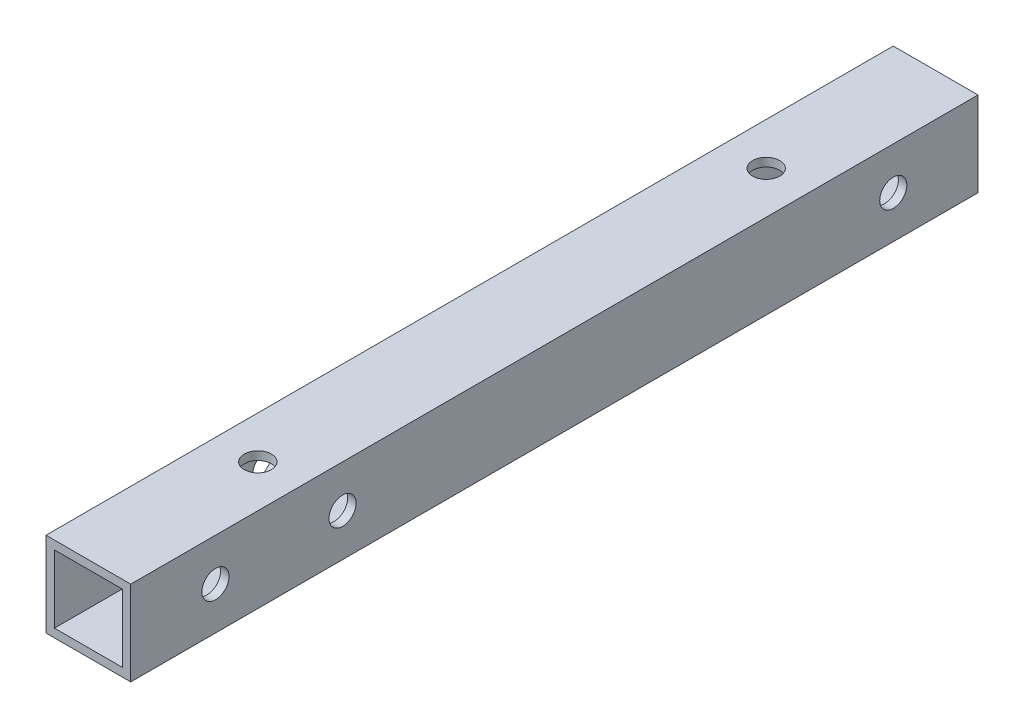
ISO-10303-21;
HEADER;
FILE_DESCRIPTION(('STEP AP214'),'2;1');
FILE_NAME('part.step','',(''),(''),'','','');
FILE_SCHEMA(('AUTOMOTIVE_DESIGN { 1 0 10303 214 1 1 1 1 }'));
ENDSEC;
DATA;
#1=APPLICATION_CONTEXT('core data for automotive mechanical design processes');
#2=APPLICATION_PROTOCOL_DEFINITION('international standard','automotive_design',2000,#1);
#3=PRODUCT_CONTEXT('',#1,'mechanical');
#4=PRODUCT('Part','Part','',(#3));
#5=PRODUCT_RELATED_PRODUCT_CATEGORY('part','',(#4));
#6=PRODUCT_DEFINITION_FORMATION('','',#4);
#7=PRODUCT_DEFINITION_CONTEXT('part definition',#1,'design');
#8=PRODUCT_DEFINITION('design','',#6,#7);
#9=PRODUCT_DEFINITION_SHAPE('','',#8);
#10=(LENGTH_UNIT() NAMED_UNIT(*) SI_UNIT(.MILLI.,.METRE.));
#11=(NAMED_UNIT(*) PLANE_ANGLE_UNIT() SI_UNIT($,.RADIAN.));
#12=(NAMED_UNIT(*) SI_UNIT($,.STERADIAN.) SOLID_ANGLE_UNIT());
#13=UNCERTAINTY_MEASURE_WITH_UNIT(LENGTH_MEASURE(1.E-05),#10,'distance_accuracy_value','');
#14=(GEOMETRIC_REPRESENTATION_CONTEXT(3) GLOBAL_UNCERTAINTY_ASSIGNED_CONTEXT((#13)) GLOBAL_UNIT_ASSIGNED_CONTEXT((#10,
#11,#12)) REPRESENTATION_CONTEXT('',''));
#15=CARTESIAN_POINT('',(0.,0.,0.));
#16=DIRECTION('',(0.,0.,1.));
#17=DIRECTION('',(1.,0.,0.));
#18=AXIS2_PLACEMENT_3D('',#15,#16,#17);
#19=CARTESIAN_POINT('',(0.,0.,100.));
#20=DIRECTION('',(0.,0.,1.));
#21=DIRECTION('',(1.,0.,0.));
#22=AXIS2_PLACEMENT_3D('',#19,#20,#21);
#23=PLANE('',#22);
#24=DIRECTION('',(0.,1.,0.));
#25=VECTOR('',#24,1.);
#26=CARTESIAN_POINT('',(5.,5.,100.));
#27=LINE('',#26,#25);
#28=CARTESIAN_POINT('',(5.,-5.,100.));
#29=VERTEX_POINT('',#28);
#30=CARTESIAN_POINT('',(5.,5.,100.));
#31=VERTEX_POINT('',#30);
#32=EDGE_CURVE('E139',#29,#31,#27,.T.);
#33=ORIENTED_EDGE('',*,*,#32,.T.);
#34=DIRECTION('',(-1.,0.,0.));
#35=VECTOR('',#34,1.);
#36=CARTESIAN_POINT('',(-5.,5.,100.));
#37=LINE('',#36,#35);
#38=CARTESIAN_POINT('',(-5.,5.,100.));
#39=VERTEX_POINT('',#38);
#40=EDGE_CURVE('E142',#31,#39,#37,.T.);
#41=ORIENTED_EDGE('',*,*,#40,.T.);
#42=DIRECTION('',(0.,-1.,0.));
#43=VECTOR('',#42,1.);
#44=CARTESIAN_POINT('',(-5.,5.,100.));
#45=LINE('',#44,#43);
#46=CARTESIAN_POINT('',(-5.,-5.,100.));
#47=VERTEX_POINT('',#46);
#48=EDGE_CURVE('E145',#39,#47,#45,.T.);
#49=ORIENTED_EDGE('',*,*,#48,.T.);
#50=DIRECTION('',(1.,0.,0.));
#51=VECTOR('',#50,1.);
#52=CARTESIAN_POINT('',(-5.,-5.,100.));
#53=LINE('',#52,#51);
#54=EDGE_CURVE('E147',#47,#29,#53,.T.);
#55=ORIENTED_EDGE('',*,*,#54,.T.);
#56=EDGE_LOOP('',(#33,#41,#49,#55));
#57=FACE_BOUND('',#56,.T.);
#58=DIRECTION('',(0.,-1.,0.));
#59=VECTOR('',#58,1.);
#60=CARTESIAN_POINT('',(-4.,4.,100.));
#61=LINE('',#60,#59);
#62=CARTESIAN_POINT('',(-4.,4.,100.));
#63=VERTEX_POINT('',#62);
#64=CARTESIAN_POINT('',(-4.,-4.,100.));
#65=VERTEX_POINT('',#64);
#66=EDGE_CURVE('E109',#63,#65,#61,.T.);
#67=ORIENTED_EDGE('',*,*,#66,.F.);
#68=DIRECTION('',(-1.,0.,0.));
#69=VECTOR('',#68,1.);
#70=CARTESIAN_POINT('',(-4.,4.,100.));
#71=LINE('',#70,#69);
#72=CARTESIAN_POINT('',(4.,4.,100.));
#73=VERTEX_POINT('',#72);
#74=EDGE_CURVE('E101',#73,#63,#71,.T.);
#75=ORIENTED_EDGE('',*,*,#74,.F.);
#76=DIRECTION('',(0.,1.,0.));
#77=VECTOR('',#76,1.);
#78=CARTESIAN_POINT('',(4.,4.,100.));
#79=LINE('',#78,#77);
#80=CARTESIAN_POINT('',(4.,-4.,100.));
#81=VERTEX_POINT('',#80);
#82=EDGE_CURVE('E123',#81,#73,#79,.T.);
#83=ORIENTED_EDGE('',*,*,#82,.F.);
#84=DIRECTION('',(1.,0.,0.));
#85=VECTOR('',#84,1.);
#86=CARTESIAN_POINT('',(-4.,-4.,100.));
#87=LINE('',#86,#85);
#88=EDGE_CURVE('E121',#65,#81,#87,.T.);
#89=ORIENTED_EDGE('',*,*,#88,.F.);
#90=EDGE_LOOP('',(#67,#75,#83,#89));
#91=FACE_BOUND('',#90,.T.);
#92=ADVANCED_FACE('F34',(#57,#91),#23,.T.);
#93=CARTESIAN_POINT('',(0.,0.,0.));
#94=DIRECTION('',(0.,0.,1.));
#95=DIRECTION('',(1.,0.,0.));
#96=AXIS2_PLACEMENT_3D('',#93,#94,#95);
#97=PLANE('',#96);
#98=DIRECTION('',(0.,1.,0.));
#99=VECTOR('',#98,1.);
#100=CARTESIAN_POINT('',(5.,5.,0.));
#101=LINE('',#100,#99);
#102=CARTESIAN_POINT('',(5.,-5.,0.));
#103=VERTEX_POINT('',#102);
#104=CARTESIAN_POINT('',(5.,5.,0.));
#105=VERTEX_POINT('',#104);
#106=EDGE_CURVE('E117',#103,#105,#101,.T.);
#107=ORIENTED_EDGE('',*,*,#106,.F.);
#108=DIRECTION('',(1.,0.,0.));
#109=VECTOR('',#108,1.);
#110=CARTESIAN_POINT('',(-5.,-5.,0.));
#111=LINE('',#110,#109);
#112=CARTESIAN_POINT('',(-5.,-5.,0.));
#113=VERTEX_POINT('',#112);
#114=EDGE_CURVE('E143',#113,#103,#111,.T.);
#115=ORIENTED_EDGE('',*,*,#114,.F.);
#116=DIRECTION('',(0.,-1.,0.));
#117=VECTOR('',#116,1.);
#118=CARTESIAN_POINT('',(-5.,5.,0.));
#119=LINE('',#118,#117);
#120=CARTESIAN_POINT('',(-5.,5.,0.));
#121=VERTEX_POINT('',#120);
#122=EDGE_CURVE('E154',#121,#113,#119,.T.);
#123=ORIENTED_EDGE('',*,*,#122,.F.);
#124=DIRECTION('',(-1.,0.,0.));
#125=VECTOR('',#124,1.);
#126=CARTESIAN_POINT('',(-5.,5.,0.));
#127=LINE('',#126,#125);
#128=EDGE_CURVE('E152',#105,#121,#127,.T.);
#129=ORIENTED_EDGE('',*,*,#128,.F.);
#130=EDGE_LOOP('',(#107,#115,#123,#129));
#131=FACE_BOUND('',#130,.T.);
#132=DIRECTION('',(-1.,0.,0.));
#133=VECTOR('',#132,1.);
#134=CARTESIAN_POINT('',(-4.,4.,0.));
#135=LINE('',#134,#133);
#136=CARTESIAN_POINT('',(4.,4.,0.));
#137=VERTEX_POINT('',#136);
#138=CARTESIAN_POINT('',(-4.,4.,0.));
#139=VERTEX_POINT('',#138);
#140=EDGE_CURVE('E59',#137,#139,#135,.T.);
#141=ORIENTED_EDGE('',*,*,#140,.T.);
#142=DIRECTION('',(0.,-1.,0.));
#143=VECTOR('',#142,1.);
#144=CARTESIAN_POINT('',(-4.,4.,0.));
#145=LINE('',#144,#143);
#146=CARTESIAN_POINT('',(-4.,-4.,0.));
#147=VERTEX_POINT('',#146);
#148=EDGE_CURVE('E116',#139,#147,#145,.T.);
#149=ORIENTED_EDGE('',*,*,#148,.T.);
#150=DIRECTION('',(1.,0.,0.));
#151=VECTOR('',#150,1.);
#152=CARTESIAN_POINT('',(-4.,-4.,0.));
#153=LINE('',#152,#151);
#154=CARTESIAN_POINT('',(4.,-4.,0.));
#155=VERTEX_POINT('',#154);
#156=EDGE_CURVE('E131',#147,#155,#153,.T.);
#157=ORIENTED_EDGE('',*,*,#156,.T.);
#158=DIRECTION('',(0.,1.,0.));
#159=VECTOR('',#158,1.);
#160=CARTESIAN_POINT('',(4.,4.,0.));
#161=LINE('',#160,#159);
#162=EDGE_CURVE('E110',#155,#137,#161,.T.);
#163=ORIENTED_EDGE('',*,*,#162,.T.);
#164=EDGE_LOOP('',(#141,#149,#157,#163));
#165=FACE_BOUND('',#164,.T.);
#166=ADVANCED_FACE('F237',(#131,#165),#97,.F.);
#167=CARTESIAN_POINT('',(5.,5.,100.));
#168=DIRECTION('',(-1.,0.,0.));
#169=DIRECTION('',(0.,-1.,0.));
#170=AXIS2_PLACEMENT_3D('',#167,#168,#169);
#171=PLANE('',#170);
#172=CARTESIAN_POINT('',(5.,0.,75.));
#173=DIRECTION('',(1.,0.,0.));
#174=DIRECTION('',(0.,1.,0.));
#175=AXIS2_PLACEMENT_3D('',#172,#173,#174);
#176=CIRCLE('',#175,1.60000000000001);
#177=CARTESIAN_POINT('',(5.,1.60000000000001,75.));
#178=VERTEX_POINT('',#177);
#179=EDGE_CURVE('E283',#178,#178,#176,.T.);
#180=ORIENTED_EDGE('',*,*,#179,.F.);
#181=EDGE_LOOP('',(#180));
#182=FACE_BOUND('',#181,.T.);
#183=CARTESIAN_POINT('',(5.,0.,10.));
#184=DIRECTION('',(-1.,0.,0.));
#185=DIRECTION('',(0.,-1.,0.));
#186=AXIS2_PLACEMENT_3D('',#183,#184,#185);
#187=CIRCLE('',#186,1.6);
#188=CARTESIAN_POINT('',(5.,-1.6,10.));
#189=VERTEX_POINT('',#188);
#190=EDGE_CURVE('E175',#189,#189,#187,.T.);
#191=ORIENTED_EDGE('',*,*,#190,.T.);
#192=EDGE_LOOP('',(#191));
#193=FACE_BOUND('',#192,.T.);
#194=CARTESIAN_POINT('',(5.,0.,90.));
#195=DIRECTION('',(-1.,0.,0.));
#196=DIRECTION('',(0.,-1.,0.));
#197=AXIS2_PLACEMENT_3D('',#194,#195,#196);
#198=CIRCLE('',#197,1.60000000000001);
#199=CARTESIAN_POINT('',(5.,-1.6,90.));
#200=VERTEX_POINT('',#199);
#201=EDGE_CURVE('E273',#200,#200,#198,.T.);
#202=ORIENTED_EDGE('',*,*,#201,.T.);
#203=EDGE_LOOP('',(#202));
#204=FACE_BOUND('',#203,.T.);
#205=ORIENTED_EDGE('',*,*,#106,.T.);
#206=DIRECTION('',(0.,0.,-1.));
#207=VECTOR('',#206,1.);
#208=CARTESIAN_POINT('',(5.,5.,100.));
#209=LINE('',#208,#207);
#210=EDGE_CURVE('E11',#31,#105,#209,.T.);
#211=ORIENTED_EDGE('',*,*,#210,.F.);
#212=ORIENTED_EDGE('',*,*,#32,.F.);
#213=DIRECTION('',(0.,0.,-1.));
#214=VECTOR('',#213,1.);
#215=CARTESIAN_POINT('',(5.,-5.,100.));
#216=LINE('',#215,#214);
#217=EDGE_CURVE('E149',#29,#103,#216,.T.);
#218=ORIENTED_EDGE('',*,*,#217,.T.);
#219=EDGE_LOOP('',(#205,#211,#212,#218));
#220=FACE_BOUND('',#219,.T.);
#221=ADVANCED_FACE('F36',(#182,#193,#204,#220),#171,.F.);
#222=CARTESIAN_POINT('',(-5.,5.,100.));
#223=DIRECTION('',(0.,-1.,0.));
#224=DIRECTION('',(0.,0.,-1.));
#225=AXIS2_PLACEMENT_3D('',#222,#223,#224);
#226=PLANE('',#225);
#227=CARTESIAN_POINT('',(0.,5.,20.));
#228=DIRECTION('',(0.,1.,0.));
#229=DIRECTION('',(0.,0.,1.));
#230=AXIS2_PLACEMENT_3D('',#227,#228,#229);
#231=CIRCLE('',#230,1.6);
#232=CARTESIAN_POINT('',(0.,5.,21.6));
#233=VERTEX_POINT('',#232);
#234=EDGE_CURVE('E194',#233,#233,#231,.T.);
#235=ORIENTED_EDGE('',*,*,#234,.F.);
#236=EDGE_LOOP('',(#235));
#237=FACE_BOUND('',#236,.T.);
#238=CARTESIAN_POINT('',(0.,5.,80.));
#239=DIRECTION('',(0.,1.,0.));
#240=DIRECTION('',(0.,0.,1.));
#241=AXIS2_PLACEMENT_3D('',#238,#239,#240);
#242=CIRCLE('',#241,1.6);
#243=CARTESIAN_POINT('',(0.,5.,81.6));
#244=VERTEX_POINT('',#243);
#245=EDGE_CURVE('E182',#244,#244,#242,.T.);
#246=ORIENTED_EDGE('',*,*,#245,.F.);
#247=EDGE_LOOP('',(#246));
#248=FACE_BOUND('',#247,.T.);
#249=ORIENTED_EDGE('',*,*,#128,.T.);
#250=DIRECTION('',(0.,0.,-1.));
#251=VECTOR('',#250,1.);
#252=CARTESIAN_POINT('',(-5.,5.,100.));
#253=LINE('',#252,#251);
#254=EDGE_CURVE('E43',#39,#121,#253,.T.);
#255=ORIENTED_EDGE('',*,*,#254,.F.);
#256=ORIENTED_EDGE('',*,*,#40,.F.);
#257=ORIENTED_EDGE('',*,*,#210,.T.);
#258=EDGE_LOOP('',(#249,#255,#256,#257));
#259=FACE_BOUND('',#258,.T.);
#260=ADVANCED_FACE('F223',(#237,#248,#259),#226,.F.);
#261=CARTESIAN_POINT('',(-5.,5.,100.));
#262=DIRECTION('',(1.,0.,0.));
#263=DIRECTION('',(0.,1.,0.));
#264=AXIS2_PLACEMENT_3D('',#261,#262,#263);
#265=PLANE('',#264);
#266=CARTESIAN_POINT('',(-5.,0.,75.));
#267=DIRECTION('',(1.,0.,0.));
#268=DIRECTION('',(0.,1.,0.));
#269=AXIS2_PLACEMENT_3D('',#266,#267,#268);
#270=CIRCLE('',#269,1.60000000000001);
#271=CARTESIAN_POINT('',(-5.,1.6,75.));
#272=VERTEX_POINT('',#271);
#273=EDGE_CURVE('E265',#272,#272,#270,.T.);
#274=ORIENTED_EDGE('',*,*,#273,.T.);
#275=EDGE_LOOP('',(#274));
#276=FACE_BOUND('',#275,.T.);
#277=CARTESIAN_POINT('',(-5.,0.,10.));
#278=DIRECTION('',(-1.,0.,0.));
#279=DIRECTION('',(0.,-1.,0.));
#280=AXIS2_PLACEMENT_3D('',#277,#278,#279);
#281=CIRCLE('',#280,1.6);
#282=CARTESIAN_POINT('',(-5.,-1.6,10.));
#283=VERTEX_POINT('',#282);
#284=EDGE_CURVE('E269',#283,#283,#281,.T.);
#285=ORIENTED_EDGE('',*,*,#284,.F.);
#286=EDGE_LOOP('',(#285));
#287=FACE_BOUND('',#286,.T.);
#288=CARTESIAN_POINT('',(-5.,0.,90.));
#289=DIRECTION('',(-1.,0.,0.));
#290=DIRECTION('',(0.,-1.,0.));
#291=AXIS2_PLACEMENT_3D('',#288,#289,#290);
#292=CIRCLE('',#291,1.60000000000001);
#293=CARTESIAN_POINT('',(-5.,-1.60000000000001,90.));
#294=VERTEX_POINT('',#293);
#295=EDGE_CURVE('E189',#294,#294,#292,.T.);
#296=ORIENTED_EDGE('',*,*,#295,.F.);
#297=EDGE_LOOP('',(#296));
#298=FACE_BOUND('',#297,.T.);
#299=ORIENTED_EDGE('',*,*,#122,.T.);
#300=DIRECTION('',(0.,0.,-1.));
#301=VECTOR('',#300,1.);
#302=CARTESIAN_POINT('',(-5.,-5.,100.));
#303=LINE('',#302,#301);
#304=EDGE_CURVE('E159',#47,#113,#303,.T.);
#305=ORIENTED_EDGE('',*,*,#304,.F.);
#306=ORIENTED_EDGE('',*,*,#48,.F.);
#307=ORIENTED_EDGE('',*,*,#254,.T.);
#308=EDGE_LOOP('',(#299,#305,#306,#307));
#309=FACE_BOUND('',#308,.T.);
#310=ADVANCED_FACE('F226',(#276,#287,#298,#309),#265,.F.);
#311=CARTESIAN_POINT('',(-5.,-5.,100.));
#312=DIRECTION('',(0.,1.,0.));
#313=DIRECTION('',(0.,0.,1.));
#314=AXIS2_PLACEMENT_3D('',#311,#312,#313);
#315=PLANE('',#314);
#316=CARTESIAN_POINT('',(0.,-5.,20.));
#317=DIRECTION('',(0.,1.,0.));
#318=DIRECTION('',(0.,0.,1.));
#319=AXIS2_PLACEMENT_3D('',#316,#317,#318);
#320=CIRCLE('',#319,1.6);
#321=CARTESIAN_POINT('',(0.,-5.,21.6));
#322=VERTEX_POINT('',#321);
#323=EDGE_CURVE('E168',#322,#322,#320,.T.);
#324=ORIENTED_EDGE('',*,*,#323,.T.);
#325=EDGE_LOOP('',(#324));
#326=FACE_BOUND('',#325,.T.);
#327=CARTESIAN_POINT('',(0.,-5.,80.));
#328=DIRECTION('',(0.,1.,0.));
#329=DIRECTION('',(0.,0.,1.));
#330=AXIS2_PLACEMENT_3D('',#327,#328,#329);
#331=CIRCLE('',#330,1.6);
#332=CARTESIAN_POINT('',(0.,-5.,81.6));
#333=VERTEX_POINT('',#332);
#334=EDGE_CURVE('E197',#333,#333,#331,.T.);
#335=ORIENTED_EDGE('',*,*,#334,.T.);
#336=EDGE_LOOP('',(#335));
#337=FACE_BOUND('',#336,.T.);
#338=ORIENTED_EDGE('',*,*,#114,.T.);
#339=ORIENTED_EDGE('',*,*,#217,.F.);
#340=ORIENTED_EDGE('',*,*,#54,.F.);
#341=ORIENTED_EDGE('',*,*,#304,.T.);
#342=EDGE_LOOP('',(#338,#339,#340,#341));
#343=FACE_BOUND('',#342,.T.);
#344=ADVANCED_FACE('F211',(#326,#337,#343),#315,.F.);
#345=CARTESIAN_POINT('',(-4.,4.,100.));
#346=DIRECTION('',(0.,-1.,0.));
#347=DIRECTION('',(0.,0.,-1.));
#348=AXIS2_PLACEMENT_3D('',#345,#346,#347);
#349=PLANE('',#348);
#350=CARTESIAN_POINT('',(0.,4.,20.));
#351=DIRECTION('',(0.,-1.,0.));
#352=DIRECTION('',(0.,0.,-1.));
#353=AXIS2_PLACEMENT_3D('',#350,#351,#352);
#354=CIRCLE('',#353,1.6);
#355=CARTESIAN_POINT('',(0.,4.,18.4));
#356=VERTEX_POINT('',#355);
#357=EDGE_CURVE('E129',#356,#356,#354,.T.);
#358=ORIENTED_EDGE('',*,*,#357,.F.);
#359=EDGE_LOOP('',(#358));
#360=FACE_BOUND('',#359,.T.);
#361=CARTESIAN_POINT('',(0.,4.,80.));
#362=DIRECTION('',(0.,-1.,0.));
#363=DIRECTION('',(0.,0.,-1.));
#364=AXIS2_PLACEMENT_3D('',#361,#362,#363);
#365=CIRCLE('',#364,1.6);
#366=CARTESIAN_POINT('',(0.,4.,78.4));
#367=VERTEX_POINT('',#366);
#368=EDGE_CURVE('E167',#367,#367,#365,.T.);
#369=ORIENTED_EDGE('',*,*,#368,.F.);
#370=EDGE_LOOP('',(#369));
#371=FACE_BOUND('',#370,.T.);
#372=ORIENTED_EDGE('',*,*,#140,.F.);
#373=DIRECTION('',(0.,0.,-1.));
#374=VECTOR('',#373,1.);
#375=CARTESIAN_POINT('',(4.,4.,100.));
#376=LINE('',#375,#374);
#377=EDGE_CURVE('E105',#73,#137,#376,.T.);
#378=ORIENTED_EDGE('',*,*,#377,.F.);
#379=ORIENTED_EDGE('',*,*,#74,.T.);
#380=DIRECTION('',(0.,0.,-1.));
#381=VECTOR('',#380,1.);
#382=CARTESIAN_POINT('',(-4.,4.,100.));
#383=LINE('',#382,#381);
#384=EDGE_CURVE('E104',#63,#139,#383,.T.);
#385=ORIENTED_EDGE('',*,*,#384,.T.);
#386=EDGE_LOOP('',(#372,#378,#379,#385));
#387=FACE_BOUND('',#386,.T.);
#388=ADVANCED_FACE('F103',(#360,#371,#387),#349,.T.);
#389=CARTESIAN_POINT('',(-4.,4.,100.));
#390=DIRECTION('',(1.,0.,0.));
#391=DIRECTION('',(0.,1.,0.));
#392=AXIS2_PLACEMENT_3D('',#389,#390,#391);
#393=PLANE('',#392);
#394=CARTESIAN_POINT('',(-4.,0.,75.));
#395=DIRECTION('',(1.,0.,0.));
#396=DIRECTION('',(0.,1.,0.));
#397=AXIS2_PLACEMENT_3D('',#394,#395,#396);
#398=CIRCLE('',#397,1.60000000000001);
#399=CARTESIAN_POINT('',(-4.,1.6,75.));
#400=VERTEX_POINT('',#399);
#401=EDGE_CURVE('E274',#400,#400,#398,.T.);
#402=ORIENTED_EDGE('',*,*,#401,.F.);
#403=EDGE_LOOP('',(#402));
#404=FACE_BOUND('',#403,.T.);
#405=CARTESIAN_POINT('',(-4.,0.,10.));
#406=DIRECTION('',(1.,0.,0.));
#407=DIRECTION('',(0.,1.,0.));
#408=AXIS2_PLACEMENT_3D('',#405,#406,#407);
#409=CIRCLE('',#408,1.6);
#410=CARTESIAN_POINT('',(-4.,-1.6,10.));
#411=VERTEX_POINT('',#410);
#412=EDGE_CURVE('E178',#411,#411,#409,.T.);
#413=ORIENTED_EDGE('',*,*,#412,.F.);
#414=EDGE_LOOP('',(#413));
#415=FACE_BOUND('',#414,.T.);
#416=CARTESIAN_POINT('',(-4.,0.,90.));
#417=DIRECTION('',(1.,0.,0.));
#418=DIRECTION('',(0.,1.,0.));
#419=AXIS2_PLACEMENT_3D('',#416,#417,#418);
#420=CIRCLE('',#419,1.60000000000001);
#421=CARTESIAN_POINT('',(-4.,-1.60000000000001,90.));
#422=VERTEX_POINT('',#421);
#423=EDGE_CURVE('E174',#422,#422,#420,.T.);
#424=ORIENTED_EDGE('',*,*,#423,.F.);
#425=EDGE_LOOP('',(#424));
#426=FACE_BOUND('',#425,.T.);
#427=ORIENTED_EDGE('',*,*,#148,.F.);
#428=ORIENTED_EDGE('',*,*,#384,.F.);
#429=ORIENTED_EDGE('',*,*,#66,.T.);
#430=DIRECTION('',(0.,0.,-1.));
#431=VECTOR('',#430,1.);
#432=CARTESIAN_POINT('',(-4.,-4.,100.));
#433=LINE('',#432,#431);
#434=EDGE_CURVE('E118',#65,#147,#433,.T.);
#435=ORIENTED_EDGE('',*,*,#434,.T.);
#436=EDGE_LOOP('',(#427,#428,#429,#435));
#437=FACE_BOUND('',#436,.T.);
#438=ADVANCED_FACE('F113',(#404,#415,#426,#437),#393,.T.);
#439=CARTESIAN_POINT('',(-4.,-4.,100.));
#440=DIRECTION('',(0.,1.,0.));
#441=DIRECTION('',(-1.,0.,0.));
#442=AXIS2_PLACEMENT_3D('',#439,#440,#441);
#443=PLANE('',#442);
#444=CARTESIAN_POINT('',(0.,-4.,20.));
#445=DIRECTION('',(0.,1.,0.));
#446=DIRECTION('',(-1.,0.,0.));
#447=AXIS2_PLACEMENT_3D('',#444,#445,#446);
#448=CIRCLE('',#447,1.6);
#449=CARTESIAN_POINT('',(-1.6,-4.,20.));
#450=VERTEX_POINT('',#449);
#451=EDGE_CURVE('E169',#450,#450,#448,.T.);
#452=ORIENTED_EDGE('',*,*,#451,.F.);
#453=EDGE_LOOP('',(#452));
#454=FACE_BOUND('',#453,.T.);
#455=CARTESIAN_POINT('',(0.,-4.,80.));
#456=DIRECTION('',(0.,1.,0.));
#457=DIRECTION('',(-1.,0.,0.));
#458=AXIS2_PLACEMENT_3D('',#455,#456,#457);
#459=CIRCLE('',#458,1.6);
#460=CARTESIAN_POINT('',(-1.6,-4.,80.));
#461=VERTEX_POINT('',#460);
#462=EDGE_CURVE('E164',#461,#461,#459,.T.);
#463=ORIENTED_EDGE('',*,*,#462,.F.);
#464=EDGE_LOOP('',(#463));
#465=FACE_BOUND('',#464,.T.);
#466=ORIENTED_EDGE('',*,*,#156,.F.);
#467=ORIENTED_EDGE('',*,*,#434,.F.);
#468=ORIENTED_EDGE('',*,*,#88,.T.);
#469=DIRECTION('',(0.,0.,-1.));
#470=VECTOR('',#469,1.);
#471=CARTESIAN_POINT('',(4.,-4.,100.));
#472=LINE('',#471,#470);
#473=EDGE_CURVE('E51',#81,#155,#472,.T.);
#474=ORIENTED_EDGE('',*,*,#473,.T.);
#475=EDGE_LOOP('',(#466,#467,#468,#474));
#476=FACE_BOUND('',#475,.T.);
#477=ADVANCED_FACE('F378',(#454,#465,#476),#443,.T.);
#478=CARTESIAN_POINT('',(4.,4.,100.));
#479=DIRECTION('',(-1.,0.,0.));
#480=DIRECTION('',(0.,-1.,0.));
#481=AXIS2_PLACEMENT_3D('',#478,#479,#480);
#482=PLANE('',#481);
#483=CARTESIAN_POINT('',(4.,0.,75.));
#484=DIRECTION('',(-1.,0.,0.));
#485=DIRECTION('',(0.,-1.,0.));
#486=AXIS2_PLACEMENT_3D('',#483,#484,#485);
#487=CIRCLE('',#486,1.60000000000001);
#488=CARTESIAN_POINT('',(4.,-1.6,75.));
#489=VERTEX_POINT('',#488);
#490=EDGE_CURVE('E38',#489,#489,#487,.T.);
#491=ORIENTED_EDGE('',*,*,#490,.F.);
#492=EDGE_LOOP('',(#491));
#493=FACE_BOUND('',#492,.T.);
#494=CARTESIAN_POINT('',(4.,0.,10.));
#495=DIRECTION('',(-1.,0.,0.));
#496=DIRECTION('',(0.,-1.,0.));
#497=AXIS2_PLACEMENT_3D('',#494,#495,#496);
#498=CIRCLE('',#497,1.6);
#499=CARTESIAN_POINT('',(4.,-1.6,10.));
#500=VERTEX_POINT('',#499);
#501=EDGE_CURVE('E176',#500,#500,#498,.T.);
#502=ORIENTED_EDGE('',*,*,#501,.F.);
#503=EDGE_LOOP('',(#502));
#504=FACE_BOUND('',#503,.T.);
#505=CARTESIAN_POINT('',(4.,0.,90.));
#506=DIRECTION('',(-1.,0.,0.));
#507=DIRECTION('',(0.,-1.,0.));
#508=AXIS2_PLACEMENT_3D('',#505,#506,#507);
#509=CIRCLE('',#508,1.60000000000001);
#510=CARTESIAN_POINT('',(4.,-1.6,90.));
#511=VERTEX_POINT('',#510);
#512=EDGE_CURVE('E172',#511,#511,#509,.T.);
#513=ORIENTED_EDGE('',*,*,#512,.F.);
#514=EDGE_LOOP('',(#513));
#515=FACE_BOUND('',#514,.T.);
#516=ORIENTED_EDGE('',*,*,#162,.F.);
#517=ORIENTED_EDGE('',*,*,#473,.F.);
#518=ORIENTED_EDGE('',*,*,#82,.T.);
#519=ORIENTED_EDGE('',*,*,#377,.T.);
#520=EDGE_LOOP('',(#516,#517,#518,#519));
#521=FACE_BOUND('',#520,.T.);
#522=ADVANCED_FACE('F371',(#493,#504,#515,#521),#482,.T.);
#523=CARTESIAN_POINT('',(0.,-5.,80.));
#524=DIRECTION('',(0.,1.,0.));
#525=DIRECTION('',(0.,0.,1.));
#526=AXIS2_PLACEMENT_3D('',#523,#524,#525);
#527=CYLINDRICAL_SURFACE('',#526,1.6);
#528=ORIENTED_EDGE('',*,*,#462,.T.);
#529=EDGE_LOOP('',(#528));
#530=FACE_BOUND('',#529,.T.);
#531=ORIENTED_EDGE('',*,*,#334,.F.);
#532=EDGE_LOOP('',(#531));
#533=FACE_BOUND('',#532,.T.);
#534=ADVANCED_FACE('F220',(#530,#533),#527,.F.);
#535=CARTESIAN_POINT('',(0.,-5.,20.));
#536=DIRECTION('',(0.,1.,0.));
#537=DIRECTION('',(0.,0.,1.));
#538=AXIS2_PLACEMENT_3D('',#535,#536,#537);
#539=CYLINDRICAL_SURFACE('',#538,1.6);
#540=ORIENTED_EDGE('',*,*,#451,.T.);
#541=EDGE_LOOP('',(#540));
#542=FACE_BOUND('',#541,.T.);
#543=ORIENTED_EDGE('',*,*,#323,.F.);
#544=EDGE_LOOP('',(#543));
#545=FACE_BOUND('',#544,.T.);
#546=ADVANCED_FACE('F218',(#542,#545),#539,.F.);
#547=ORIENTED_EDGE('',*,*,#368,.T.);
#548=EDGE_LOOP('',(#547));
#549=FACE_BOUND('',#548,.T.);
#550=ORIENTED_EDGE('',*,*,#245,.T.);
#551=EDGE_LOOP('',(#550));
#552=FACE_BOUND('',#551,.T.);
#553=ADVANCED_FACE('F215',(#549,#552),#527,.F.);
#554=ORIENTED_EDGE('',*,*,#357,.T.);
#555=EDGE_LOOP('',(#554));
#556=FACE_BOUND('',#555,.T.);
#557=ORIENTED_EDGE('',*,*,#234,.T.);
#558=EDGE_LOOP('',(#557));
#559=FACE_BOUND('',#558,.T.);
#560=ADVANCED_FACE('F206',(#556,#559),#539,.F.);
#561=CARTESIAN_POINT('',(5.,0.,90.));
#562=DIRECTION('',(-1.,0.,0.));
#563=DIRECTION('',(0.,-1.,0.));
#564=AXIS2_PLACEMENT_3D('',#561,#562,#563);
#565=CYLINDRICAL_SURFACE('',#564,1.60000000000001);
#566=CARTESIAN_POINT('',(4.,-1.6,90.));
#567=CARTESIAN_POINT('',(4.01041666666667,-1.6,90.));
#568=CARTESIAN_POINT('',(4.02083333333333,-1.6,90.));
#569=CARTESIAN_POINT('',(4.04166666666667,-1.6,90.));
#570=CARTESIAN_POINT('',(4.05208333333333,-1.6,90.));
#571=CARTESIAN_POINT('',(4.07291666666667,-1.6,90.));
#572=CARTESIAN_POINT('',(4.08333333333333,-1.6,90.));
#573=CARTESIAN_POINT('',(4.10416666666667,-1.6,90.));
#574=CARTESIAN_POINT('',(4.11458333333333,-1.6,90.));
#575=CARTESIAN_POINT('',(4.13541666666667,-1.6,90.));
#576=CARTESIAN_POINT('',(4.14583333333333,-1.6,90.));
#577=CARTESIAN_POINT('',(4.16666666666667,-1.6,90.));
#578=CARTESIAN_POINT('',(4.17708333333333,-1.6,90.));
#579=CARTESIAN_POINT('',(4.19791666666667,-1.6,90.));
#580=CARTESIAN_POINT('',(4.20833333333333,-1.6,90.));
#581=CARTESIAN_POINT('',(4.22916666666667,-1.6,90.));
#582=CARTESIAN_POINT('',(4.23958333333333,-1.6,90.));
#583=CARTESIAN_POINT('',(4.26041666666667,-1.6,90.));
#584=CARTESIAN_POINT('',(4.27083333333333,-1.6,90.));
#585=CARTESIAN_POINT('',(4.29166666666667,-1.6,90.));
#586=CARTESIAN_POINT('',(4.30208333333333,-1.6,90.));
#587=CARTESIAN_POINT('',(4.32291666666667,-1.6,90.));
#588=CARTESIAN_POINT('',(4.33333333333333,-1.6,90.));
#589=CARTESIAN_POINT('',(4.35416666666667,-1.6,90.));
#590=CARTESIAN_POINT('',(4.36458333333333,-1.6,90.));
#591=CARTESIAN_POINT('',(4.38541666666667,-1.6,90.));
#592=CARTESIAN_POINT('',(4.39583333333333,-1.6,90.));
#593=CARTESIAN_POINT('',(4.41666666666667,-1.6,90.));
#594=CARTESIAN_POINT('',(4.42708333333333,-1.6,90.));
#595=CARTESIAN_POINT('',(4.44791666666667,-1.6,90.));
#596=CARTESIAN_POINT('',(4.45833333333333,-1.6,90.));
#597=CARTESIAN_POINT('',(4.47916666666667,-1.6,90.));
#598=CARTESIAN_POINT('',(4.48958333333333,-1.6,90.));
#599=CARTESIAN_POINT('',(4.51041666666667,-1.6,90.));
#600=CARTESIAN_POINT('',(4.52083333333333,-1.6,90.));
#601=CARTESIAN_POINT('',(4.54166666666667,-1.6,90.));
#602=CARTESIAN_POINT('',(4.55208333333333,-1.6,90.));
#603=CARTESIAN_POINT('',(4.57291666666667,-1.6,90.));
#604=CARTESIAN_POINT('',(4.58333333333333,-1.6,90.));
#605=CARTESIAN_POINT('',(4.60416666666667,-1.6,90.));
#606=CARTESIAN_POINT('',(4.61458333333333,-1.6,90.));
#607=CARTESIAN_POINT('',(4.63541666666667,-1.6,90.));
#608=CARTESIAN_POINT('',(4.64583333333333,-1.6,90.));
#609=CARTESIAN_POINT('',(4.66666666666667,-1.6,90.));
#610=CARTESIAN_POINT('',(4.67708333333333,-1.6,90.));
#611=CARTESIAN_POINT('',(4.69791666666667,-1.6,90.));
#612=CARTESIAN_POINT('',(4.70833333333333,-1.6,90.));
#613=CARTESIAN_POINT('',(4.72916666666667,-1.6,90.));
#614=CARTESIAN_POINT('',(4.73958333333334,-1.6,90.));
#615=CARTESIAN_POINT('',(4.76041666666667,-1.6,90.));
#616=CARTESIAN_POINT('',(4.77083333333334,-1.6,90.));
#617=CARTESIAN_POINT('',(4.79166666666667,-1.6,90.));
#618=CARTESIAN_POINT('',(4.80208333333334,-1.6,90.));
#619=CARTESIAN_POINT('',(4.82291666666667,-1.6,90.));
#620=CARTESIAN_POINT('',(4.83333333333334,-1.6,90.));
#621=CARTESIAN_POINT('',(4.85416666666667,-1.6,90.));
#622=CARTESIAN_POINT('',(4.86458333333334,-1.6,90.));
#623=CARTESIAN_POINT('',(4.88541666666667,-1.6,90.));
#624=CARTESIAN_POINT('',(4.89583333333334,-1.6,90.));
#625=CARTESIAN_POINT('',(4.91666666666667,-1.6,90.));
#626=CARTESIAN_POINT('',(4.92708333333334,-1.6,90.));
#627=CARTESIAN_POINT('',(4.94791666666667,-1.6,90.));
#628=CARTESIAN_POINT('',(4.95833333333334,-1.6,90.));
#629=CARTESIAN_POINT('',(4.97916666666667,-1.6,90.));
#630=CARTESIAN_POINT('',(4.98958333333334,-1.6,90.));
#631=CARTESIAN_POINT('',(5.,-1.6,90.));
#632=B_SPLINE_CURVE_WITH_KNOTS('',3,(#566,#567,#568,#569,#570,#571,#572,#573,#574,#575,#576,
#577,#578,#579,#580,#581,#582,#583,#584,#585,#586,#587,#588,#589,#590,#591,#592,#593,#594,#595,
#596,#597,#598,#599,#600,#601,#602,#603,#604,#605,#606,#607,#608,#609,#610,#611,#612,#613,#614,
#615,#616,#617,#618,#619,#620,#621,#622,#623,#624,#625,#626,#627,#628,#629,#630,#631),
.UNSPECIFIED.,.F.,.F.,(4,2,2,2,2,2,2,2,2,2,2,2,2,2,2,2,2,2,2,2,2,2,2,2,2,2,2,2,2,2,2,2,4),(0.,
0.03125,0.0625000000000001,0.0937500000000009,0.125000000000001,0.156250000000001,
0.187500000000001,0.218750000000001,0.250000000000001,0.281250000000001,0.312500000000001,
0.343750000000001,0.375000000000001,0.406250000000002,0.437500000000002,0.468750000000002,
0.500000000000002,0.531250000000002,0.562500000000002,0.593750000000002,0.625000000000002,
0.656250000000002,0.687500000000002,0.718750000000003,0.750000000000003,0.781250000000003,
0.812500000000003,0.843750000000003,0.875000000000003,0.906250000000003,0.937500000000003,
0.968750000000003,1.),.UNSPECIFIED.);
#633=EDGE_CURVE('BSEAM303',#511,#200,#632,.T.);
#634=ORIENTED_EDGE('',*,*,#512,.T.);
#635=ORIENTED_EDGE('',*,*,#201,.F.);
#636=ORIENTED_EDGE('',*,*,#633,.T.);
#637=ORIENTED_EDGE('',*,*,#633,.F.);
#638=EDGE_LOOP('',(#634,#636,#635,#637));
#639=FACE_BOUND('',#638,.T.);
#640=ADVANCED_FACE('F303',(#639),#565,.F.);
#641=CARTESIAN_POINT('',(5.,0.,10.));
#642=DIRECTION('',(-1.,0.,0.));
#643=DIRECTION('',(0.,-1.,0.));
#644=AXIS2_PLACEMENT_3D('',#641,#642,#643);
#645=CYLINDRICAL_SURFACE('',#644,1.6);
#646=CARTESIAN_POINT('',(4.,-1.6,10.));
#647=CARTESIAN_POINT('',(4.01041666666667,-1.6,10.));
#648=CARTESIAN_POINT('',(4.02083333333333,-1.6,10.));
#649=CARTESIAN_POINT('',(4.04166666666667,-1.6,10.));
#650=CARTESIAN_POINT('',(4.05208333333333,-1.6,10.));
#651=CARTESIAN_POINT('',(4.07291666666667,-1.6,10.));
#652=CARTESIAN_POINT('',(4.08333333333333,-1.6,10.));
#653=CARTESIAN_POINT('',(4.10416666666667,-1.6,10.));
#654=CARTESIAN_POINT('',(4.11458333333333,-1.6,10.));
#655=CARTESIAN_POINT('',(4.13541666666667,-1.6,10.));
#656=CARTESIAN_POINT('',(4.14583333333333,-1.6,10.));
#657=CARTESIAN_POINT('',(4.16666666666667,-1.6,10.));
#658=CARTESIAN_POINT('',(4.17708333333333,-1.6,10.));
#659=CARTESIAN_POINT('',(4.19791666666667,-1.6,10.));
#660=CARTESIAN_POINT('',(4.20833333333333,-1.6,10.));
#661=CARTESIAN_POINT('',(4.22916666666667,-1.6,10.));
#662=CARTESIAN_POINT('',(4.23958333333333,-1.6,10.));
#663=CARTESIAN_POINT('',(4.26041666666667,-1.6,10.));
#664=CARTESIAN_POINT('',(4.27083333333333,-1.6,10.));
#665=CARTESIAN_POINT('',(4.29166666666667,-1.6,10.));
#666=CARTESIAN_POINT('',(4.30208333333333,-1.6,10.));
#667=CARTESIAN_POINT('',(4.32291666666667,-1.6,10.));
#668=CARTESIAN_POINT('',(4.33333333333333,-1.6,10.));
#669=CARTESIAN_POINT('',(4.35416666666667,-1.6,10.));
#670=CARTESIAN_POINT('',(4.36458333333333,-1.6,10.));
#671=CARTESIAN_POINT('',(4.38541666666667,-1.6,10.));
#672=CARTESIAN_POINT('',(4.39583333333333,-1.6,10.));
#673=CARTESIAN_POINT('',(4.41666666666667,-1.6,10.));
#674=CARTESIAN_POINT('',(4.42708333333333,-1.6,10.));
#675=CARTESIAN_POINT('',(4.44791666666667,-1.6,10.));
#676=CARTESIAN_POINT('',(4.45833333333333,-1.6,10.));
#677=CARTESIAN_POINT('',(4.47916666666667,-1.6,10.));
#678=CARTESIAN_POINT('',(4.48958333333333,-1.6,10.));
#679=CARTESIAN_POINT('',(4.51041666666667,-1.6,10.));
#680=CARTESIAN_POINT('',(4.52083333333333,-1.6,10.));
#681=CARTESIAN_POINT('',(4.54166666666667,-1.6,10.));
#682=CARTESIAN_POINT('',(4.55208333333333,-1.6,10.));
#683=CARTESIAN_POINT('',(4.57291666666667,-1.6,10.));
#684=CARTESIAN_POINT('',(4.58333333333333,-1.6,10.));
#685=CARTESIAN_POINT('',(4.60416666666667,-1.6,10.));
#686=CARTESIAN_POINT('',(4.61458333333333,-1.6,10.));
#687=CARTESIAN_POINT('',(4.63541666666667,-1.6,10.));
#688=CARTESIAN_POINT('',(4.64583333333333,-1.6,10.));
#689=CARTESIAN_POINT('',(4.66666666666667,-1.6,10.));
#690=CARTESIAN_POINT('',(4.67708333333333,-1.6,10.));
#691=CARTESIAN_POINT('',(4.69791666666667,-1.6,10.));
#692=CARTESIAN_POINT('',(4.70833333333333,-1.6,10.));
#693=CARTESIAN_POINT('',(4.72916666666667,-1.6,10.));
#694=CARTESIAN_POINT('',(4.73958333333334,-1.6,10.));
#695=CARTESIAN_POINT('',(4.76041666666667,-1.6,10.));
#696=CARTESIAN_POINT('',(4.77083333333334,-1.6,10.));
#697=CARTESIAN_POINT('',(4.79166666666667,-1.6,10.));
#698=CARTESIAN_POINT('',(4.80208333333334,-1.6,10.));
#699=CARTESIAN_POINT('',(4.82291666666667,-1.6,10.));
#700=CARTESIAN_POINT('',(4.83333333333334,-1.6,10.));
#701=CARTESIAN_POINT('',(4.85416666666667,-1.6,10.));
#702=CARTESIAN_POINT('',(4.86458333333334,-1.6,10.));
#703=CARTESIAN_POINT('',(4.88541666666667,-1.6,10.));
#704=CARTESIAN_POINT('',(4.89583333333334,-1.6,10.));
#705=CARTESIAN_POINT('',(4.91666666666667,-1.6,10.));
#706=CARTESIAN_POINT('',(4.92708333333334,-1.6,10.));
#707=CARTESIAN_POINT('',(4.94791666666667,-1.6,10.));
#708=CARTESIAN_POINT('',(4.95833333333334,-1.6,10.));
#709=CARTESIAN_POINT('',(4.97916666666667,-1.6,10.));
#710=CARTESIAN_POINT('',(4.98958333333334,-1.6,10.));
#711=CARTESIAN_POINT('',(5.,-1.6,10.));
#712=B_SPLINE_CURVE_WITH_KNOTS('',3,(#646,#647,#648,#649,#650,#651,#652,#653,#654,#655,#656,
#657,#658,#659,#660,#661,#662,#663,#664,#665,#666,#667,#668,#669,#670,#671,#672,#673,#674,#675,
#676,#677,#678,#679,#680,#681,#682,#683,#684,#685,#686,#687,#688,#689,#690,#691,#692,#693,#694,
#695,#696,#697,#698,#699,#700,#701,#702,#703,#704,#705,#706,#707,#708,#709,#710,#711),
.UNSPECIFIED.,.F.,.F.,(4,2,2,2,2,2,2,2,2,2,2,2,2,2,2,2,2,2,2,2,2,2,2,2,2,2,2,2,2,2,2,2,4),(0.,
0.03125,0.0625000000000001,0.0937500000000009,0.125000000000001,0.156250000000001,
0.187500000000001,0.218750000000001,0.250000000000001,0.281250000000001,0.312500000000001,
0.343750000000001,0.375000000000001,0.406250000000002,0.437500000000002,0.468750000000002,
0.500000000000002,0.531250000000002,0.562500000000002,0.593750000000002,0.625000000000002,
0.656250000000002,0.687500000000002,0.718750000000003,0.750000000000003,0.781250000000003,
0.812500000000003,0.843750000000003,0.875000000000003,0.906250000000003,0.937500000000003,
0.968750000000003,1.),.UNSPECIFIED.);
#713=EDGE_CURVE('BSEAM294',#500,#189,#712,.T.);
#714=ORIENTED_EDGE('',*,*,#501,.T.);
#715=ORIENTED_EDGE('',*,*,#190,.F.);
#716=ORIENTED_EDGE('',*,*,#713,.T.);
#717=ORIENTED_EDGE('',*,*,#713,.F.);
#718=EDGE_LOOP('',(#714,#716,#715,#717));
#719=FACE_BOUND('',#718,.T.);
#720=ADVANCED_FACE('F294',(#719),#645,.F.);
#721=CARTESIAN_POINT('',(-4.,-1.60000000000001,90.));
#722=CARTESIAN_POINT('',(-4.01041666666667,-1.60000000000001,90.));
#723=CARTESIAN_POINT('',(-4.02083333333333,-1.60000000000001,90.));
#724=CARTESIAN_POINT('',(-4.04166666666667,-1.60000000000001,90.));
#725=CARTESIAN_POINT('',(-4.05208333333333,-1.60000000000001,90.));
#726=CARTESIAN_POINT('',(-4.07291666666667,-1.60000000000001,90.));
#727=CARTESIAN_POINT('',(-4.08333333333333,-1.60000000000001,90.));
#728=CARTESIAN_POINT('',(-4.10416666666667,-1.60000000000001,90.));
#729=CARTESIAN_POINT('',(-4.11458333333333,-1.60000000000001,90.));
#730=CARTESIAN_POINT('',(-4.13541666666667,-1.60000000000001,90.));
#731=CARTESIAN_POINT('',(-4.14583333333333,-1.60000000000001,90.));
#732=CARTESIAN_POINT('',(-4.16666666666667,-1.60000000000001,90.));
#733=CARTESIAN_POINT('',(-4.17708333333333,-1.60000000000001,90.));
#734=CARTESIAN_POINT('',(-4.19791666666667,-1.60000000000001,90.));
#735=CARTESIAN_POINT('',(-4.20833333333333,-1.60000000000001,90.));
#736=CARTESIAN_POINT('',(-4.22916666666667,-1.60000000000001,90.));
#737=CARTESIAN_POINT('',(-4.23958333333333,-1.60000000000001,90.));
#738=CARTESIAN_POINT('',(-4.26041666666667,-1.60000000000001,90.));
#739=CARTESIAN_POINT('',(-4.27083333333333,-1.60000000000001,90.));
#740=CARTESIAN_POINT('',(-4.29166666666667,-1.60000000000001,90.));
#741=CARTESIAN_POINT('',(-4.30208333333333,-1.60000000000001,90.));
#742=CARTESIAN_POINT('',(-4.32291666666667,-1.60000000000001,90.));
#743=CARTESIAN_POINT('',(-4.33333333333333,-1.60000000000001,90.));
#744=CARTESIAN_POINT('',(-4.35416666666667,-1.60000000000001,90.));
#745=CARTESIAN_POINT('',(-4.36458333333333,-1.60000000000001,90.));
#746=CARTESIAN_POINT('',(-4.38541666666667,-1.60000000000001,90.));
#747=CARTESIAN_POINT('',(-4.39583333333333,-1.60000000000001,90.));
#748=CARTESIAN_POINT('',(-4.41666666666667,-1.60000000000001,90.));
#749=CARTESIAN_POINT('',(-4.42708333333333,-1.60000000000001,90.));
#750=CARTESIAN_POINT('',(-4.44791666666667,-1.60000000000001,90.));
#751=CARTESIAN_POINT('',(-4.45833333333333,-1.60000000000001,90.));
#752=CARTESIAN_POINT('',(-4.47916666666667,-1.60000000000001,90.));
#753=CARTESIAN_POINT('',(-4.48958333333333,-1.60000000000001,90.));
#754=CARTESIAN_POINT('',(-4.51041666666667,-1.60000000000001,90.));
#755=CARTESIAN_POINT('',(-4.52083333333333,-1.60000000000001,90.));
#756=CARTESIAN_POINT('',(-4.54166666666667,-1.60000000000001,90.));
#757=CARTESIAN_POINT('',(-4.55208333333333,-1.60000000000001,90.));
#758=CARTESIAN_POINT('',(-4.57291666666667,-1.60000000000001,90.));
#759=CARTESIAN_POINT('',(-4.58333333333333,-1.60000000000001,90.));
#760=CARTESIAN_POINT('',(-4.60416666666667,-1.60000000000001,90.));
#761=CARTESIAN_POINT('',(-4.61458333333333,-1.60000000000001,90.));
#762=CARTESIAN_POINT('',(-4.63541666666667,-1.60000000000001,90.));
#763=CARTESIAN_POINT('',(-4.64583333333333,-1.60000000000001,90.));
#764=CARTESIAN_POINT('',(-4.66666666666667,-1.60000000000001,90.));
#765=CARTESIAN_POINT('',(-4.67708333333333,-1.60000000000001,90.));
#766=CARTESIAN_POINT('',(-4.69791666666667,-1.60000000000001,90.));
#767=CARTESIAN_POINT('',(-4.70833333333333,-1.60000000000001,90.));
#768=CARTESIAN_POINT('',(-4.72916666666667,-1.60000000000001,90.));
#769=CARTESIAN_POINT('',(-4.73958333333333,-1.60000000000001,90.));
#770=CARTESIAN_POINT('',(-4.76041666666667,-1.60000000000001,90.));
#771=CARTESIAN_POINT('',(-4.77083333333333,-1.60000000000001,90.));
#772=CARTESIAN_POINT('',(-4.79166666666667,-1.60000000000001,90.));
#773=CARTESIAN_POINT('',(-4.80208333333333,-1.60000000000001,90.));
#774=CARTESIAN_POINT('',(-4.82291666666667,-1.60000000000001,90.));
#775=CARTESIAN_POINT('',(-4.83333333333333,-1.60000000000001,90.));
#776=CARTESIAN_POINT('',(-4.85416666666667,-1.60000000000001,90.));
#777=CARTESIAN_POINT('',(-4.86458333333333,-1.60000000000001,90.));
#778=CARTESIAN_POINT('',(-4.88541666666667,-1.60000000000001,90.));
#779=CARTESIAN_POINT('',(-4.89583333333333,-1.60000000000001,90.));
#780=CARTESIAN_POINT('',(-4.91666666666667,-1.60000000000001,90.));
#781=CARTESIAN_POINT('',(-4.92708333333333,-1.60000000000001,90.));
#782=CARTESIAN_POINT('',(-4.94791666666667,-1.60000000000001,90.));
#783=CARTESIAN_POINT('',(-4.95833333333333,-1.60000000000001,90.));
#784=CARTESIAN_POINT('',(-4.97916666666667,-1.60000000000001,90.));
#785=CARTESIAN_POINT('',(-4.98958333333333,-1.60000000000001,90.));
#786=CARTESIAN_POINT('',(-5.,-1.60000000000001,90.));
#787=B_SPLINE_CURVE_WITH_KNOTS('',3,(#721,#722,#723,#724,#725,#726,#727,#728,#729,#730,#731,
#732,#733,#734,#735,#736,#737,#738,#739,#740,#741,#742,#743,#744,#745,#746,#747,#748,#749,#750,
#751,#752,#753,#754,#755,#756,#757,#758,#759,#760,#761,#762,#763,#764,#765,#766,#767,#768,#769,
#770,#771,#772,#773,#774,#775,#776,#777,#778,#779,#780,#781,#782,#783,#784,#785,#786),
.UNSPECIFIED.,.F.,.F.,(4,2,2,2,2,2,2,2,2,2,2,2,2,2,2,2,2,2,2,2,2,2,2,2,2,2,2,2,2,2,2,2,4),(0.,
0.03125,0.0625000000000001,0.0937500000000001,0.125,0.15625,0.1875,0.21875,0.25,0.28125,0.3125,
0.34375,0.375,0.40625,0.4375,0.46875,0.5,0.53125,0.5625,0.593750000000001,0.625000000000001,
0.656250000000001,0.687500000000001,0.718750000000001,0.750000000000001,0.781250000000001,
0.812500000000001,0.843750000000001,0.875000000000001,0.906250000000001,0.937500000000001,
0.968750000000001,1.),.UNSPECIFIED.);
#788=EDGE_CURVE('BSEAM291',#422,#294,#787,.T.);
#789=ORIENTED_EDGE('',*,*,#423,.T.);
#790=ORIENTED_EDGE('',*,*,#295,.T.);
#791=ORIENTED_EDGE('',*,*,#788,.T.);
#792=ORIENTED_EDGE('',*,*,#788,.F.);
#793=EDGE_LOOP('',(#789,#791,#790,#792));
#794=FACE_BOUND('',#793,.T.);
#795=ADVANCED_FACE('F291',(#794),#565,.F.);
#796=CARTESIAN_POINT('',(-4.,-1.6,10.));
#797=CARTESIAN_POINT('',(-4.01041666666667,-1.6,10.));
#798=CARTESIAN_POINT('',(-4.02083333333333,-1.6,10.));
#799=CARTESIAN_POINT('',(-4.04166666666667,-1.6,10.));
#800=CARTESIAN_POINT('',(-4.05208333333333,-1.6,10.));
#801=CARTESIAN_POINT('',(-4.07291666666667,-1.6,10.));
#802=CARTESIAN_POINT('',(-4.08333333333333,-1.6,10.));
#803=CARTESIAN_POINT('',(-4.10416666666667,-1.6,10.));
#804=CARTESIAN_POINT('',(-4.11458333333333,-1.6,10.));
#805=CARTESIAN_POINT('',(-4.13541666666667,-1.6,10.));
#806=CARTESIAN_POINT('',(-4.14583333333333,-1.6,10.));
#807=CARTESIAN_POINT('',(-4.16666666666667,-1.6,10.));
#808=CARTESIAN_POINT('',(-4.17708333333333,-1.6,10.));
#809=CARTESIAN_POINT('',(-4.19791666666667,-1.6,10.));
#810=CARTESIAN_POINT('',(-4.20833333333333,-1.6,10.));
#811=CARTESIAN_POINT('',(-4.22916666666667,-1.6,10.));
#812=CARTESIAN_POINT('',(-4.23958333333333,-1.6,10.));
#813=CARTESIAN_POINT('',(-4.26041666666667,-1.6,10.));
#814=CARTESIAN_POINT('',(-4.27083333333333,-1.6,10.));
#815=CARTESIAN_POINT('',(-4.29166666666667,-1.6,10.));
#816=CARTESIAN_POINT('',(-4.30208333333333,-1.6,10.));
#817=CARTESIAN_POINT('',(-4.32291666666667,-1.6,10.));
#818=CARTESIAN_POINT('',(-4.33333333333333,-1.6,10.));
#819=CARTESIAN_POINT('',(-4.35416666666667,-1.6,10.));
#820=CARTESIAN_POINT('',(-4.36458333333333,-1.6,10.));
#821=CARTESIAN_POINT('',(-4.38541666666667,-1.6,10.));
#822=CARTESIAN_POINT('',(-4.39583333333333,-1.6,10.));
#823=CARTESIAN_POINT('',(-4.41666666666667,-1.6,10.));
#824=CARTESIAN_POINT('',(-4.42708333333333,-1.6,10.));
#825=CARTESIAN_POINT('',(-4.44791666666667,-1.6,10.));
#826=CARTESIAN_POINT('',(-4.45833333333333,-1.6,10.));
#827=CARTESIAN_POINT('',(-4.47916666666667,-1.6,10.));
#828=CARTESIAN_POINT('',(-4.48958333333333,-1.6,10.));
#829=CARTESIAN_POINT('',(-4.51041666666667,-1.6,10.));
#830=CARTESIAN_POINT('',(-4.52083333333333,-1.6,10.));
#831=CARTESIAN_POINT('',(-4.54166666666667,-1.6,10.));
#832=CARTESIAN_POINT('',(-4.55208333333333,-1.6,10.));
#833=CARTESIAN_POINT('',(-4.57291666666667,-1.6,10.));
#834=CARTESIAN_POINT('',(-4.58333333333333,-1.6,10.));
#835=CARTESIAN_POINT('',(-4.60416666666667,-1.6,10.));
#836=CARTESIAN_POINT('',(-4.61458333333333,-1.6,10.));
#837=CARTESIAN_POINT('',(-4.63541666666667,-1.6,10.));
#838=CARTESIAN_POINT('',(-4.64583333333333,-1.6,10.));
#839=CARTESIAN_POINT('',(-4.66666666666667,-1.6,10.));
#840=CARTESIAN_POINT('',(-4.67708333333333,-1.6,10.));
#841=CARTESIAN_POINT('',(-4.69791666666667,-1.6,10.));
#842=CARTESIAN_POINT('',(-4.70833333333333,-1.6,10.));
#843=CARTESIAN_POINT('',(-4.72916666666667,-1.6,10.));
#844=CARTESIAN_POINT('',(-4.73958333333333,-1.6,10.));
#845=CARTESIAN_POINT('',(-4.76041666666667,-1.6,10.));
#846=CARTESIAN_POINT('',(-4.77083333333333,-1.6,10.));
#847=CARTESIAN_POINT('',(-4.79166666666667,-1.6,10.));
#848=CARTESIAN_POINT('',(-4.80208333333333,-1.6,10.));
#849=CARTESIAN_POINT('',(-4.82291666666667,-1.6,10.));
#850=CARTESIAN_POINT('',(-4.83333333333333,-1.6,10.));
#851=CARTESIAN_POINT('',(-4.85416666666667,-1.6,10.));
#852=CARTESIAN_POINT('',(-4.86458333333333,-1.6,10.));
#853=CARTESIAN_POINT('',(-4.88541666666667,-1.6,10.));
#854=CARTESIAN_POINT('',(-4.89583333333333,-1.6,10.));
#855=CARTESIAN_POINT('',(-4.91666666666667,-1.6,10.));
#856=CARTESIAN_POINT('',(-4.92708333333333,-1.6,10.));
#857=CARTESIAN_POINT('',(-4.94791666666667,-1.6,10.));
#858=CARTESIAN_POINT('',(-4.95833333333333,-1.6,10.));
#859=CARTESIAN_POINT('',(-4.97916666666667,-1.6,10.));
#860=CARTESIAN_POINT('',(-4.98958333333333,-1.6,10.));
#861=CARTESIAN_POINT('',(-5.,-1.6,10.));
#862=B_SPLINE_CURVE_WITH_KNOTS('',3,(#796,#797,#798,#799,#800,#801,#802,#803,#804,#805,#806,
#807,#808,#809,#810,#811,#812,#813,#814,#815,#816,#817,#818,#819,#820,#821,#822,#823,#824,#825,
#826,#827,#828,#829,#830,#831,#832,#833,#834,#835,#836,#837,#838,#839,#840,#841,#842,#843,#844,
#845,#846,#847,#848,#849,#850,#851,#852,#853,#854,#855,#856,#857,#858,#859,#860,#861),
.UNSPECIFIED.,.F.,.F.,(4,2,2,2,2,2,2,2,2,2,2,2,2,2,2,2,2,2,2,2,2,2,2,2,2,2,2,2,2,2,2,2,4),(0.,
0.03125,0.0625000000000001,0.0937500000000001,0.125,0.15625,0.1875,0.21875,0.25,0.28125,0.3125,
0.34375,0.375,0.40625,0.4375,0.46875,0.5,0.53125,0.5625,0.593750000000001,0.625000000000001,
0.656250000000001,0.687500000000001,0.718750000000001,0.750000000000001,0.781250000000001,
0.812500000000001,0.843750000000001,0.875000000000001,0.906250000000001,0.937500000000001,
0.968750000000001,1.),.UNSPECIFIED.);
#863=EDGE_CURVE('BSEAM288',#411,#283,#862,.T.);
#864=ORIENTED_EDGE('',*,*,#412,.T.);
#865=ORIENTED_EDGE('',*,*,#284,.T.);
#866=ORIENTED_EDGE('',*,*,#863,.T.);
#867=ORIENTED_EDGE('',*,*,#863,.F.);
#868=EDGE_LOOP('',(#864,#866,#865,#867));
#869=FACE_BOUND('',#868,.T.);
#870=ADVANCED_FACE('F288',(#869),#645,.F.);
#871=CARTESIAN_POINT('',(-5.,0.,75.));
#872=DIRECTION('',(1.,0.,0.));
#873=DIRECTION('',(0.,1.,0.));
#874=AXIS2_PLACEMENT_3D('',#871,#872,#873);
#875=CYLINDRICAL_SURFACE('',#874,1.60000000000001);
#876=ORIENTED_EDGE('',*,*,#490,.T.);
#877=EDGE_LOOP('',(#876));
#878=FACE_BOUND('',#877,.T.);
#879=ORIENTED_EDGE('',*,*,#179,.T.);
#880=EDGE_LOOP('',(#879));
#881=FACE_BOUND('',#880,.T.);
#882=ADVANCED_FACE('F290',(#878,#881),#875,.F.);
#883=ORIENTED_EDGE('',*,*,#401,.T.);
#884=EDGE_LOOP('',(#883));
#885=FACE_BOUND('',#884,.T.);
#886=ORIENTED_EDGE('',*,*,#273,.F.);
#887=EDGE_LOOP('',(#886));
#888=FACE_BOUND('',#887,.T.);
#889=ADVANCED_FACE('F299',(#885,#888),#875,.F.);
#890=CLOSED_SHELL('',(#92,#166,#221,#260,#310,#344,#388,#438,#477,#522,#534,#546,#553,#560,#640,
#720,#795,#870,#882,#889));
#891=MANIFOLD_SOLID_BREP('B2',#890);
#892=ADVANCED_BREP_SHAPE_REPRESENTATION('',(#18,#891),#14);
#893=SHAPE_DEFINITION_REPRESENTATION(#9,#892);
ENDSEC;
END-ISO-10303-21;
